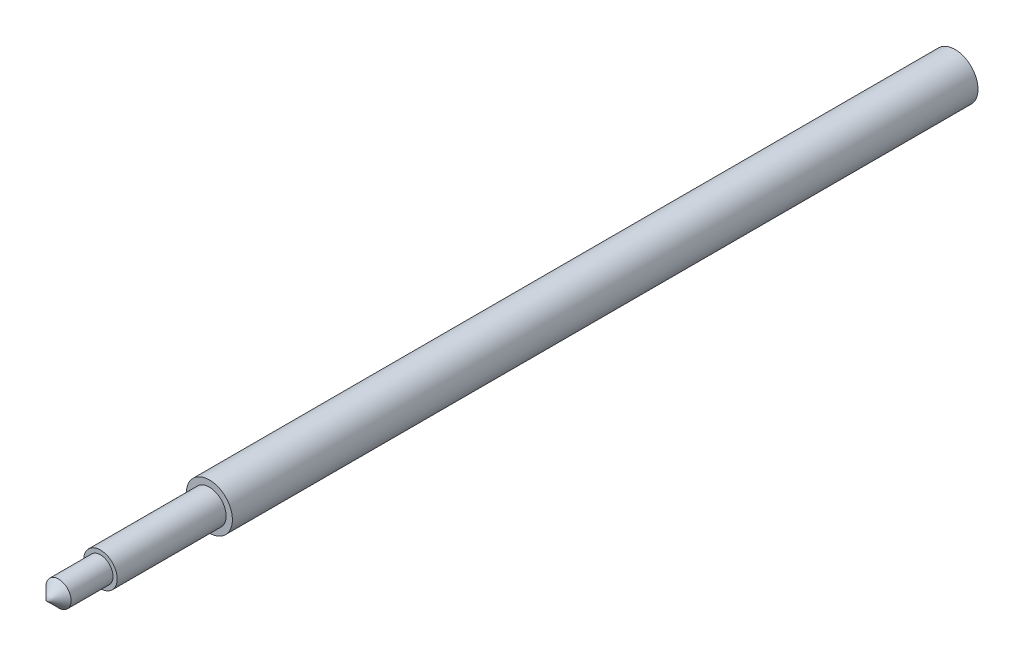
ISO-10303-21;
HEADER;
FILE_DESCRIPTION(('STEP AP214'),'2;1');
FILE_NAME('part.step','',(''),(''),'','','');
FILE_SCHEMA(('AUTOMOTIVE_DESIGN { 1 0 10303 214 1 1 1 1 }'));
ENDSEC;
DATA;
#1=APPLICATION_CONTEXT('core data for automotive mechanical design processes');
#2=APPLICATION_PROTOCOL_DEFINITION('international standard','automotive_design',2000,#1);
#3=PRODUCT_CONTEXT('',#1,'mechanical');
#4=PRODUCT('Part','Part','',(#3));
#5=PRODUCT_RELATED_PRODUCT_CATEGORY('part','',(#4));
#6=PRODUCT_DEFINITION_FORMATION('','',#4);
#7=PRODUCT_DEFINITION_CONTEXT('part definition',#1,'design');
#8=PRODUCT_DEFINITION('design','',#6,#7);
#9=PRODUCT_DEFINITION_SHAPE('','',#8);
#10=(LENGTH_UNIT() NAMED_UNIT(*) SI_UNIT(.MILLI.,.METRE.));
#11=(NAMED_UNIT(*) PLANE_ANGLE_UNIT() SI_UNIT($,.RADIAN.));
#12=(NAMED_UNIT(*) SI_UNIT($,.STERADIAN.) SOLID_ANGLE_UNIT());
#13=UNCERTAINTY_MEASURE_WITH_UNIT(LENGTH_MEASURE(1.E-05),#10,'distance_accuracy_value','');
#14=(GEOMETRIC_REPRESENTATION_CONTEXT(3) GLOBAL_UNCERTAINTY_ASSIGNED_CONTEXT((#13)) GLOBAL_UNIT_ASSIGNED_CONTEXT((#10,
#11,#12)) REPRESENTATION_CONTEXT('',''));
#15=CARTESIAN_POINT('',(0.,0.,0.));
#16=DIRECTION('',(0.,0.,1.));
#17=DIRECTION('',(1.,0.,0.));
#18=AXIS2_PLACEMENT_3D('',#15,#16,#17);
#19=CARTESIAN_POINT('',(0.,0.,89.));
#20=DIRECTION('',(0.,0.,-1.));
#21=DIRECTION('',(-1.,0.,0.));
#22=AXIS2_PLACEMENT_3D('',#19,#20,#21);
#23=CYLINDRICAL_SURFACE('',#22,2.75);
#24=CARTESIAN_POINT('',(0.,0.,89.));
#25=DIRECTION('',(0.,0.,1.));
#26=DIRECTION('',(1.,0.,0.));
#27=AXIS2_PLACEMENT_3D('',#24,#25,#26);
#28=CIRCLE('',#27,2.75);
#29=CARTESIAN_POINT('',(2.75,0.,89.));
#30=VERTEX_POINT('',#29);
#31=EDGE_CURVE('E65',#30,#30,#28,.T.);
#32=ORIENTED_EDGE('',*,*,#31,.F.);
#33=EDGE_LOOP('',(#32));
#34=FACE_BOUND('',#33,.T.);
#35=CARTESIAN_POINT('',(0.,0.,0.));
#36=DIRECTION('',(0.,0.,1.));
#37=DIRECTION('',(1.,0.,0.));
#38=AXIS2_PLACEMENT_3D('',#35,#36,#37);
#39=CIRCLE('',#38,2.75);
#40=CARTESIAN_POINT('',(2.75,0.,0.));
#41=VERTEX_POINT('',#40);
#42=EDGE_CURVE('E42',#41,#41,#39,.T.);
#43=ORIENTED_EDGE('',*,*,#42,.T.);
#44=EDGE_LOOP('',(#43));
#45=FACE_BOUND('',#44,.T.);
#46=ADVANCED_FACE('F39',(#34,#45),#23,.T.);
#47=CARTESIAN_POINT('',(0.,0.,89.));
#48=DIRECTION('',(0.,0.,1.));
#49=DIRECTION('',(1.,0.,0.));
#50=AXIS2_PLACEMENT_3D('',#47,#48,#49);
#51=PLANE('',#50);
#52=CARTESIAN_POINT('',(0.,0.,89.));
#53=DIRECTION('',(0.,0.,1.));
#54=DIRECTION('',(1.,0.,0.));
#55=AXIS2_PLACEMENT_3D('',#52,#53,#54);
#56=CIRCLE('',#55,2.);
#57=CARTESIAN_POINT('',(-2.,0.,89.));
#58=VERTEX_POINT('',#57);
#59=EDGE_CURVE('E46',#58,#58,#56,.T.);
#60=ORIENTED_EDGE('',*,*,#59,.F.);
#61=EDGE_LOOP('',(#60));
#62=FACE_BOUND('',#61,.T.);
#63=ORIENTED_EDGE('',*,*,#31,.T.);
#64=EDGE_LOOP('',(#63));
#65=FACE_BOUND('',#64,.T.);
#66=ADVANCED_FACE('F76',(#62,#65),#51,.T.);
#67=CARTESIAN_POINT('',(0.,0.,0.));
#68=DIRECTION('',(0.,0.,1.));
#69=DIRECTION('',(1.,0.,0.));
#70=AXIS2_PLACEMENT_3D('',#67,#68,#69);
#71=PLANE('',#70);
#72=ORIENTED_EDGE('',*,*,#42,.F.);
#73=EDGE_LOOP('',(#72));
#74=FACE_BOUND('',#73,.T.);
#75=ADVANCED_FACE('F73',(#74),#71,.F.);
#76=CARTESIAN_POINT('',(0.,0.,102.));
#77=DIRECTION('',(0.,0.,-1.));
#78=DIRECTION('',(-1.,0.,0.));
#79=AXIS2_PLACEMENT_3D('',#76,#77,#78);
#80=CYLINDRICAL_SURFACE('',#79,2.);
#81=CARTESIAN_POINT('',(0.,0.,102.));
#82=DIRECTION('',(0.,0.,1.));
#83=DIRECTION('',(1.,0.,0.));
#84=AXIS2_PLACEMENT_3D('',#81,#82,#83);
#85=CIRCLE('',#84,2.);
#86=CARTESIAN_POINT('',(-2.,0.,102.));
#87=VERTEX_POINT('',#86);
#88=EDGE_CURVE('E59',#87,#87,#85,.T.);
#89=CARTESIAN_POINT('',(-2.,0.,102.));
#90=CARTESIAN_POINT('',(-2.,0.,101.864583333333));
#91=CARTESIAN_POINT('',(-2.,0.,101.729166666667));
#92=CARTESIAN_POINT('',(-2.,0.,101.458333333333));
#93=CARTESIAN_POINT('',(-2.,0.,101.322916666667));
#94=CARTESIAN_POINT('',(-2.,0.,101.052083333333));
#95=CARTESIAN_POINT('',(-2.,0.,100.916666666667));
#96=CARTESIAN_POINT('',(-2.,0.,100.645833333333));
#97=CARTESIAN_POINT('',(-2.,0.,100.510416666667));
#98=CARTESIAN_POINT('',(-2.,0.,100.239583333333));
#99=CARTESIAN_POINT('',(-2.,0.,100.104166666667));
#100=CARTESIAN_POINT('',(-2.,0.,99.8333333333333));
#101=CARTESIAN_POINT('',(-2.,0.,99.6979166666666));
#102=CARTESIAN_POINT('',(-2.,0.,99.4270833333333));
#103=CARTESIAN_POINT('',(-2.,0.,99.2916666666667));
#104=CARTESIAN_POINT('',(-2.,0.,99.0208333333333));
#105=CARTESIAN_POINT('',(-2.,0.,98.8854166666667));
#106=CARTESIAN_POINT('',(-2.,0.,98.6145833333333));
#107=CARTESIAN_POINT('',(-2.,0.,98.4791666666666));
#108=CARTESIAN_POINT('',(-2.,0.,98.2083333333333));
#109=CARTESIAN_POINT('',(-2.,0.,98.0729166666666));
#110=CARTESIAN_POINT('',(-2.,0.,97.8020833333333));
#111=CARTESIAN_POINT('',(-2.,0.,97.6666666666667));
#112=CARTESIAN_POINT('',(-2.,0.,97.3958333333333));
#113=CARTESIAN_POINT('',(-2.,0.,97.2604166666667));
#114=CARTESIAN_POINT('',(-2.,0.,96.9895833333333));
#115=CARTESIAN_POINT('',(-2.,0.,96.8541666666667));
#116=CARTESIAN_POINT('',(-2.,0.,96.5833333333333));
#117=CARTESIAN_POINT('',(-2.,0.,96.4479166666666));
#118=CARTESIAN_POINT('',(-2.,0.,96.1770833333333));
#119=CARTESIAN_POINT('',(-2.,0.,96.0416666666667));
#120=CARTESIAN_POINT('',(-2.,0.,95.7708333333333));
#121=CARTESIAN_POINT('',(-2.,0.,95.6354166666667));
#122=CARTESIAN_POINT('',(-2.,0.,95.3645833333333));
#123=CARTESIAN_POINT('',(-2.,0.,95.2291666666667));
#124=CARTESIAN_POINT('',(-2.,0.,94.9583333333333));
#125=CARTESIAN_POINT('',(-2.,0.,94.8229166666666));
#126=CARTESIAN_POINT('',(-2.,0.,94.5520833333333));
#127=CARTESIAN_POINT('',(-2.,0.,94.4166666666666));
#128=CARTESIAN_POINT('',(-2.,0.,94.1458333333333));
#129=CARTESIAN_POINT('',(-2.,0.,94.0104166666667));
#130=CARTESIAN_POINT('',(-2.,0.,93.7395833333333));
#131=CARTESIAN_POINT('',(-2.,0.,93.6041666666667));
#132=CARTESIAN_POINT('',(-2.,0.,93.3333333333333));
#133=CARTESIAN_POINT('',(-2.,0.,93.1979166666667));
#134=CARTESIAN_POINT('',(-2.,0.,92.9270833333333));
#135=CARTESIAN_POINT('',(-2.,0.,92.7916666666666));
#136=CARTESIAN_POINT('',(-2.,0.,92.5208333333333));
#137=CARTESIAN_POINT('',(-2.,0.,92.3854166666667));
#138=CARTESIAN_POINT('',(-2.,0.,92.1145833333333));
#139=CARTESIAN_POINT('',(-2.,0.,91.9791666666667));
#140=CARTESIAN_POINT('',(-2.,0.,91.7083333333333));
#141=CARTESIAN_POINT('',(-2.,0.,91.5729166666667));
#142=CARTESIAN_POINT('',(-2.,0.,91.3020833333333));
#143=CARTESIAN_POINT('',(-2.,0.,91.1666666666666));
#144=CARTESIAN_POINT('',(-2.,0.,90.8958333333333));
#145=CARTESIAN_POINT('',(-2.,0.,90.7604166666666));
#146=CARTESIAN_POINT('',(-2.,0.,90.4895833333333));
#147=CARTESIAN_POINT('',(-2.,0.,90.3541666666667));
#148=CARTESIAN_POINT('',(-2.,0.,90.0833333333333));
#149=CARTESIAN_POINT('',(-2.,0.,89.9479166666667));
#150=CARTESIAN_POINT('',(-2.,0.,89.6770833333333));
#151=CARTESIAN_POINT('',(-2.,0.,89.5416666666667));
#152=CARTESIAN_POINT('',(-2.,0.,89.2708333333333));
#153=CARTESIAN_POINT('',(-2.,0.,89.1354166666666));
#154=CARTESIAN_POINT('',(-2.,0.,89.));
#155=B_SPLINE_CURVE_WITH_KNOTS('',3,(#89,#90,#91,#92,#93,#94,#95,#96,#97,#98,#99,#100,#101,#102,
#103,#104,#105,#106,#107,#108,#109,#110,#111,#112,#113,#114,#115,#116,#117,#118,#119,#120,#121,
#122,#123,#124,#125,#126,#127,#128,#129,#130,#131,#132,#133,#134,#135,#136,#137,#138,#139,#140,
#141,#142,#143,#144,#145,#146,#147,#148,#149,#150,#151,#152,#153,#154),.UNSPECIFIED.,.F.,.F.,(4,
2,2,2,2,2,2,2,2,2,2,2,2,2,2,2,2,2,2,2,2,2,2,2,2,2,2,2,2,2,2,2,4),(0.,0.406249999999997,
0.812499999999994,1.21874999999999,1.62499999999999,2.03125,2.4375,2.84374999999999,
3.24999999999999,3.65625,4.0625,4.46874999999999,4.87499999999999,5.28124999999999,5.6875,
6.09374999999999,6.49999999999999,6.90624999999999,7.3125,7.71875,8.12499999999999,
8.53124999999999,8.93749999999999,9.34375,9.74999999999999,10.15625,10.5625,10.96875,11.375,
11.78125,12.1875,12.59375,13.),.UNSPECIFIED.);
#156=EDGE_CURVE('BSEAM75',#87,#58,#155,.T.);
#157=ORIENTED_EDGE('',*,*,#88,.F.);
#158=ORIENTED_EDGE('',*,*,#59,.T.);
#159=ORIENTED_EDGE('',*,*,#156,.T.);
#160=ORIENTED_EDGE('',*,*,#156,.F.);
#161=EDGE_LOOP('',(#157,#159,#158,#160));
#162=FACE_BOUND('',#161,.T.);
#163=ADVANCED_FACE('F75',(#162),#80,.T.);
#164=CARTESIAN_POINT('',(0.,0.,102.));
#165=DIRECTION('',(0.,0.,1.));
#166=DIRECTION('',(1.,0.,0.));
#167=AXIS2_PLACEMENT_3D('',#164,#165,#166);
#168=PLANE('',#167);
#169=CARTESIAN_POINT('',(0.,0.,102.));
#170=DIRECTION('',(0.,0.,1.));
#171=DIRECTION('',(1.,0.,0.));
#172=AXIS2_PLACEMENT_3D('',#169,#170,#171);
#173=CIRCLE('',#172,1.5);
#174=CARTESIAN_POINT('',(1.5,0.,102.));
#175=VERTEX_POINT('',#174);
#176=EDGE_CURVE('E11',#175,#175,#173,.T.);
#177=ORIENTED_EDGE('',*,*,#176,.F.);
#178=EDGE_LOOP('',(#177));
#179=FACE_BOUND('',#178,.T.);
#180=ORIENTED_EDGE('',*,*,#88,.T.);
#181=EDGE_LOOP('',(#180));
#182=FACE_BOUND('',#181,.T.);
#183=ADVANCED_FACE('F82',(#179,#182),#168,.T.);
#184=CARTESIAN_POINT('',(0.,0.,107.));
#185=DIRECTION('',(0.,0.,-1.));
#186=DIRECTION('',(-1.,0.,0.));
#187=AXIS2_PLACEMENT_3D('',#184,#185,#186);
#188=CYLINDRICAL_SURFACE('',#187,1.5);
#189=CARTESIAN_POINT('',(0.,0.,107.));
#190=DIRECTION('',(0.,0.,1.));
#191=DIRECTION('',(1.,0.,0.));
#192=AXIS2_PLACEMENT_3D('',#189,#190,#191);
#193=CIRCLE('',#192,1.5);
#194=CARTESIAN_POINT('',(1.5,0.,107.));
#195=VERTEX_POINT('',#194);
#196=EDGE_CURVE('E57',#195,#195,#193,.T.);
#197=ORIENTED_EDGE('',*,*,#196,.F.);
#198=EDGE_LOOP('',(#197));
#199=FACE_BOUND('',#198,.T.);
#200=ORIENTED_EDGE('',*,*,#176,.T.);
#201=EDGE_LOOP('',(#200));
#202=FACE_BOUND('',#201,.T.);
#203=ADVANCED_FACE('F53',(#199,#202),#188,.T.);
#204=CARTESIAN_POINT('',(0.,0.,107.));
#205=DIRECTION('',(0.,0.,-1.));
#206=DIRECTION('',(-1.,0.,0.));
#207=AXIS2_PLACEMENT_3D('',#204,#205,#206);
#208=CONICAL_SURFACE('',#207,1.5,0.785386026681324);
#209=CARTESIAN_POINT('',(0.,0.,108.50003641059));
#210=VERTEX_POINT('',#209);
#211=VERTEX_LOOP('',#210);
#212=FACE_BOUND('',#211,.T.);
#213=ORIENTED_EDGE('',*,*,#196,.T.);
#214=EDGE_LOOP('',(#213));
#215=FACE_BOUND('',#214,.T.);
#216=ADVANCED_FACE('F50',(#212,#215),#208,.T.);
#217=CLOSED_SHELL('',(#46,#66,#75,#163,#183,#203,#216));
#218=MANIFOLD_SOLID_BREP('B2',#217);
#219=ADVANCED_BREP_SHAPE_REPRESENTATION('',(#18,#218),#14);
#220=SHAPE_DEFINITION_REPRESENTATION(#9,#219);
ENDSEC;
END-ISO-10303-21;
